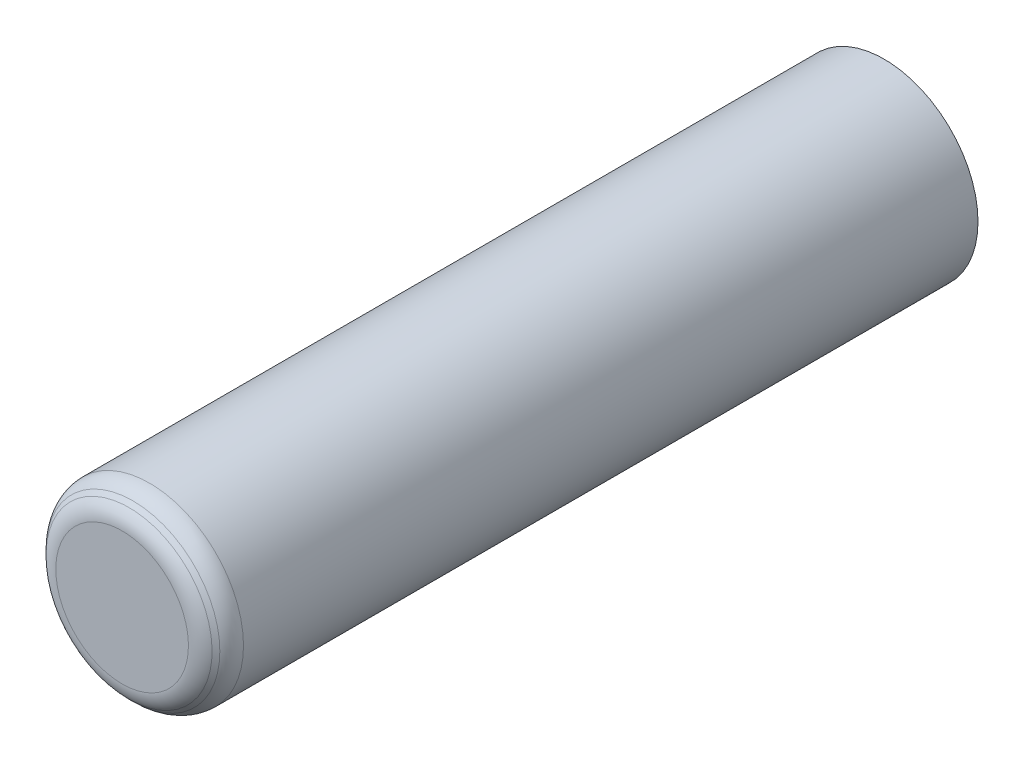
ISO-10303-21;
HEADER;
FILE_DESCRIPTION(('STEP AP214'),'2;1');
FILE_NAME('part.step','',(''),(''),'','','');
FILE_SCHEMA(('AUTOMOTIVE_DESIGN { 1 0 10303 214 1 1 1 1 }'));
ENDSEC;
DATA;
#1=APPLICATION_CONTEXT('core data for automotive mechanical design processes');
#2=APPLICATION_PROTOCOL_DEFINITION('international standard','automotive_design',2000,#1);
#3=PRODUCT_CONTEXT('',#1,'mechanical');
#4=PRODUCT('Part','Part','',(#3));
#5=PRODUCT_RELATED_PRODUCT_CATEGORY('part','',(#4));
#6=PRODUCT_DEFINITION_FORMATION('','',#4);
#7=PRODUCT_DEFINITION_CONTEXT('part definition',#1,'design');
#8=PRODUCT_DEFINITION('design','',#6,#7);
#9=PRODUCT_DEFINITION_SHAPE('','',#8);
#10=(LENGTH_UNIT() NAMED_UNIT(*) SI_UNIT(.MILLI.,.METRE.));
#11=(NAMED_UNIT(*) PLANE_ANGLE_UNIT() SI_UNIT($,.RADIAN.));
#12=(NAMED_UNIT(*) SI_UNIT($,.STERADIAN.) SOLID_ANGLE_UNIT());
#13=UNCERTAINTY_MEASURE_WITH_UNIT(LENGTH_MEASURE(1.E-05),#10,'distance_accuracy_value','');
#14=(GEOMETRIC_REPRESENTATION_CONTEXT(3) GLOBAL_UNCERTAINTY_ASSIGNED_CONTEXT((#13)) GLOBAL_UNIT_ASSIGNED_CONTEXT((#10,
#11,#12)) REPRESENTATION_CONTEXT('',''));
#15=CARTESIAN_POINT('',(0.,0.,0.));
#16=DIRECTION('',(0.,0.,1.));
#17=DIRECTION('',(1.,0.,0.));
#18=AXIS2_PLACEMENT_3D('',#15,#16,#17);
#19=CARTESIAN_POINT('',(0.,0.,-3.2));
#20=DIRECTION('',(0.,0.,1.));
#21=DIRECTION('',(1.,0.,0.));
#22=AXIS2_PLACEMENT_3D('',#19,#20,#21);
#23=PLANE('',#22);
#24=CARTESIAN_POINT('',(0.,0.,-3.2));
#25=DIRECTION('',(0.,0.,-1.));
#26=DIRECTION('',(1.,0.,0.));
#27=AXIS2_PLACEMENT_3D('',#24,#25,#26);
#28=CIRCLE('',#27,1.5875);
#29=CARTESIAN_POINT('',(1.5875,0.,-3.2));
#30=VERTEX_POINT('',#29);
#31=EDGE_CURVE('E11',#30,#30,#28,.T.);
#32=ORIENTED_EDGE('',*,*,#31,.T.);
#33=EDGE_LOOP('',(#32));
#34=FACE_BOUND('',#33,.T.);
#35=ADVANCED_FACE('F17',(#34),#23,.F.);
#36=CARTESIAN_POINT('',(0.,0.,9.69));
#37=DIRECTION('',(0.,0.,-1.));
#38=DIRECTION('',(0.,1.,0.));
#39=AXIS2_PLACEMENT_3D('',#36,#37,#38);
#40=CYLINDRICAL_SURFACE('',#39,1.5875);
#41=CARTESIAN_POINT('',(0.,0.,9.22431457505077));
#42=DIRECTION('',(0.,0.,-1.));
#43=DIRECTION('',(0.,-1.,0.));
#44=AXIS2_PLACEMENT_3D('',#41,#42,#43);
#45=CIRCLE('',#44,1.5875);
#46=CARTESIAN_POINT('',(0.,-1.5875,9.22431457505077));
#47=VERTEX_POINT('',#46);
#48=EDGE_CURVE('E26',#47,#47,#45,.T.);
#49=ORIENTED_EDGE('',*,*,#48,.T.);
#50=EDGE_LOOP('',(#49));
#51=FACE_BOUND('',#50,.T.);
#52=ORIENTED_EDGE('',*,*,#31,.F.);
#53=EDGE_LOOP('',(#52));
#54=FACE_BOUND('',#53,.T.);
#55=ADVANCED_FACE('F121',(#51,#54),#40,.T.);
#56=CARTESIAN_POINT('',(0.,0.,9.22431457505077));
#57=DIRECTION('',(0.,0.,1.));
#58=DIRECTION('',(0.,-1.,0.));
#59=AXIS2_PLACEMENT_3D('',#56,#57,#58);
#60=TOROIDAL_SURFACE('',#59,1.1875,0.4);
#61=ORIENTED_EDGE('',*,*,#48,.F.);
#62=EDGE_LOOP('',(#61));
#63=FACE_BOUND('',#62,.T.);
#64=CARTESIAN_POINT('',(0.,0.,9.50715728752539));
#65=DIRECTION('',(0.,0.,1.));
#66=DIRECTION('',(0.,1.,0.));
#67=AXIS2_PLACEMENT_3D('',#64,#65,#66);
#68=CIRCLE('',#67,1.47034271247462);
#69=CARTESIAN_POINT('',(0.,1.47034271247462,9.50715728752539));
#70=VERTEX_POINT('',#69);
#71=EDGE_CURVE('E65',#70,#70,#68,.T.);
#72=ORIENTED_EDGE('',*,*,#71,.F.);
#73=EDGE_LOOP('',(#72));
#74=FACE_BOUND('',#73,.T.);
#75=ADVANCED_FACE('F113',(#63,#74),#60,.T.);
#76=CARTESIAN_POINT('',(0.,0.,9.69));
#77=DIRECTION('',(0.,0.,-1.));
#78=DIRECTION('',(0.,1.,0.));
#79=AXIS2_PLACEMENT_3D('',#76,#77,#78);
#80=CONICAL_SURFACE('',#79,1.2875,0.785398163397448);
#81=CARTESIAN_POINT('',(0.,0.,9.57284271247463));
#82=DIRECTION('',(0.,0.,-1.));
#83=DIRECTION('',(0.,-1.,0.));
#84=AXIS2_PLACEMENT_3D('',#81,#82,#83);
#85=CIRCLE('',#84,1.40465728752538);
#86=CARTESIAN_POINT('',(0.,-1.40465728752538,9.57284271247463));
#87=VERTEX_POINT('',#86);
#88=EDGE_CURVE('E59',#87,#87,#85,.T.);
#89=ORIENTED_EDGE('',*,*,#88,.T.);
#90=EDGE_LOOP('',(#89));
#91=FACE_BOUND('',#90,.T.);
#92=ORIENTED_EDGE('',*,*,#71,.T.);
#93=EDGE_LOOP('',(#92));
#94=FACE_BOUND('',#93,.T.);
#95=ADVANCED_FACE('F19',(#91,#94),#80,.T.);
#96=CARTESIAN_POINT('',(0.,0.,9.29));
#97=DIRECTION('',(0.,0.,1.));
#98=DIRECTION('',(0.,-1.,0.));
#99=AXIS2_PLACEMENT_3D('',#96,#97,#98);
#100=TOROIDAL_SURFACE('',#99,1.12181457505076,0.4);
#101=ORIENTED_EDGE('',*,*,#88,.F.);
#102=EDGE_LOOP('',(#101));
#103=FACE_BOUND('',#102,.T.);
#104=CARTESIAN_POINT('',(0.,0.,9.69));
#105=DIRECTION('',(0.,0.,1.));
#106=DIRECTION('',(0.,-1.,0.));
#107=AXIS2_PLACEMENT_3D('',#104,#105,#106);
#108=CIRCLE('',#107,1.12181457505076);
#109=CARTESIAN_POINT('',(0.,-1.12181457505076,9.69));
#110=VERTEX_POINT('',#109);
#111=EDGE_CURVE('E55',#110,#110,#108,.T.);
#112=ORIENTED_EDGE('',*,*,#111,.F.);
#113=EDGE_LOOP('',(#112));
#114=FACE_BOUND('',#113,.T.);
#115=ADVANCED_FACE('F93',(#103,#114),#100,.T.);
#116=CARTESIAN_POINT('',(0.,0.,9.69));
#117=DIRECTION('',(0.,0.,1.));
#118=DIRECTION('',(1.,0.,0.));
#119=AXIS2_PLACEMENT_3D('',#116,#117,#118);
#120=PLANE('',#119);
#121=ORIENTED_EDGE('',*,*,#111,.T.);
#122=EDGE_LOOP('',(#121));
#123=FACE_BOUND('',#122,.T.);
#124=ADVANCED_FACE('F56',(#123),#120,.T.);
#125=CLOSED_SHELL('',(#35,#55,#75,#95,#115,#124));
#126=MANIFOLD_SOLID_BREP('B1',#125);
#127=ADVANCED_BREP_SHAPE_REPRESENTATION('',(#18,#126),#14);
#128=SHAPE_DEFINITION_REPRESENTATION(#9,#127);
ENDSEC;
END-ISO-10303-21;
